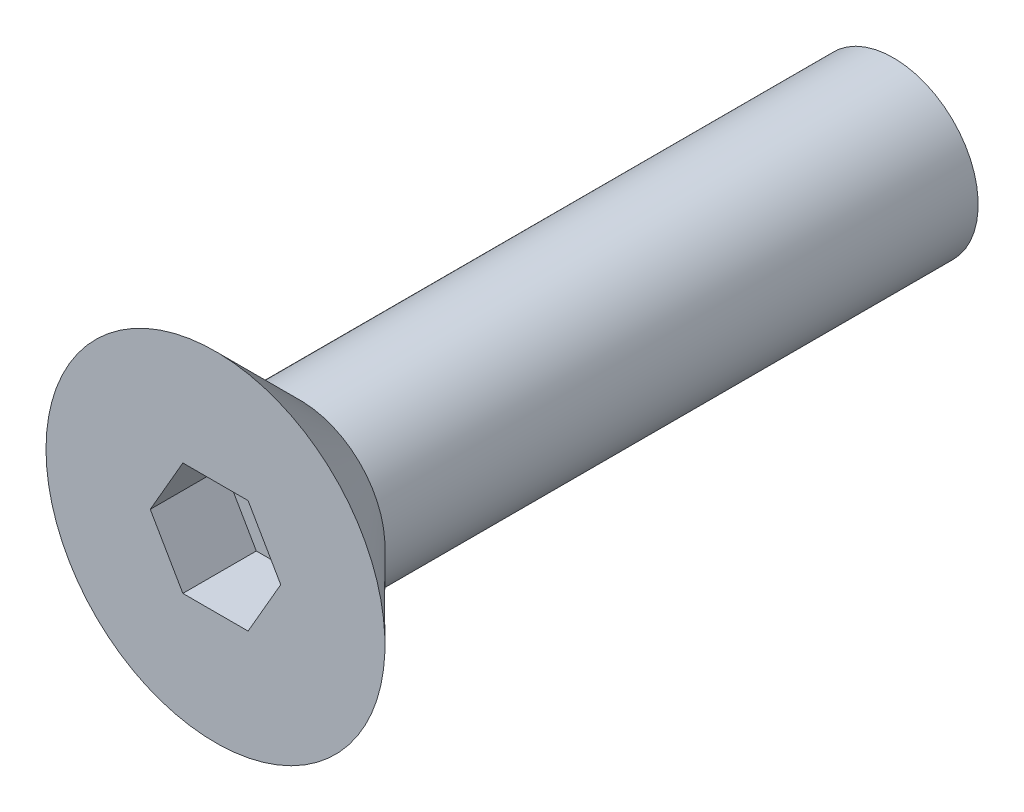
ISO-10303-21;
HEADER;
FILE_DESCRIPTION(('STEP AP214'),'2;1');
FILE_NAME('part.step','',(''),(''),'','','');
FILE_SCHEMA(('AUTOMOTIVE_DESIGN { 1 0 10303 214 1 1 1 1 }'));
ENDSEC;
DATA;
#1=APPLICATION_CONTEXT('core data for automotive mechanical design processes');
#2=APPLICATION_PROTOCOL_DEFINITION('international standard','automotive_design',2000,#1);
#3=PRODUCT_CONTEXT('',#1,'mechanical');
#4=PRODUCT('Part','Part','',(#3));
#5=PRODUCT_RELATED_PRODUCT_CATEGORY('part','',(#4));
#6=PRODUCT_DEFINITION_FORMATION('','',#4);
#7=PRODUCT_DEFINITION_CONTEXT('part definition',#1,'design');
#8=PRODUCT_DEFINITION('design','',#6,#7);
#9=PRODUCT_DEFINITION_SHAPE('','',#8);
#10=(LENGTH_UNIT() NAMED_UNIT(*) SI_UNIT(.MILLI.,.METRE.));
#11=(NAMED_UNIT(*) PLANE_ANGLE_UNIT() SI_UNIT($,.RADIAN.));
#12=(NAMED_UNIT(*) SI_UNIT($,.STERADIAN.) SOLID_ANGLE_UNIT());
#13=UNCERTAINTY_MEASURE_WITH_UNIT(LENGTH_MEASURE(1.E-05),#10,'distance_accuracy_value','');
#14=(GEOMETRIC_REPRESENTATION_CONTEXT(3) GLOBAL_UNCERTAINTY_ASSIGNED_CONTEXT((#13)) GLOBAL_UNIT_ASSIGNED_CONTEXT((#10,
#11,#12)) REPRESENTATION_CONTEXT('',''));
#15=CARTESIAN_POINT('',(0.,0.,0.));
#16=DIRECTION('',(0.,0.,1.));
#17=DIRECTION('',(1.,0.,0.));
#18=AXIS2_PLACEMENT_3D('',#15,#16,#17);
#19=CARTESIAN_POINT('',(0.,0.,-1.3));
#20=DIRECTION('',(0.,0.,1.));
#21=DIRECTION('',(1.,0.,0.));
#22=AXIS2_PLACEMENT_3D('',#19,#20,#21);
#23=PLANE('',#22);
#24=DIRECTION('',(-0.50000000000019,0.866025403784329,0.));
#25=VECTOR('',#24,1.);
#26=CARTESIAN_POINT('',(1.154700538379,0.,-1.3));
#27=LINE('',#26,#25);
#28=CARTESIAN_POINT('',(1.154700538379,0.,-1.3));
#29=VERTEX_POINT('',#28);
#30=CARTESIAN_POINT('',(0.57735026919,1.,-1.3));
#31=VERTEX_POINT('',#30);
#32=EDGE_CURVE('E10',#29,#31,#27,.T.);
#33=ORIENTED_EDGE('',*,*,#32,.T.);
#34=DIRECTION('',(-1.,0.,0.));
#35=VECTOR('',#34,1.);
#36=CARTESIAN_POINT('',(0.57735026919,1.,-1.3));
#37=LINE('',#36,#35);
#38=CARTESIAN_POINT('',(-0.57735026919,1.,-1.3));
#39=VERTEX_POINT('',#38);
#40=EDGE_CURVE('E124',#31,#39,#37,.T.);
#41=ORIENTED_EDGE('',*,*,#40,.T.);
#42=DIRECTION('',(-0.50000000000019,-0.866025403784329,0.));
#43=VECTOR('',#42,1.);
#44=CARTESIAN_POINT('',(-0.57735026919,1.,-1.3));
#45=LINE('',#44,#43);
#46=CARTESIAN_POINT('',(-1.154700538379,0.,-1.3));
#47=VERTEX_POINT('',#46);
#48=EDGE_CURVE('E136',#39,#47,#45,.T.);
#49=ORIENTED_EDGE('',*,*,#48,.T.);
#50=DIRECTION('',(0.50000000000019,-0.866025403784329,0.));
#51=VECTOR('',#50,1.);
#52=CARTESIAN_POINT('',(-1.154700538379,0.,-1.3));
#53=LINE('',#52,#51);
#54=CARTESIAN_POINT('',(-0.57735026919,-1.,-1.3));
#55=VERTEX_POINT('',#54);
#56=EDGE_CURVE('E144',#47,#55,#53,.T.);
#57=ORIENTED_EDGE('',*,*,#56,.T.);
#58=DIRECTION('',(1.,0.,0.));
#59=VECTOR('',#58,1.);
#60=CARTESIAN_POINT('',(-0.57735026919,-1.,-1.3));
#61=LINE('',#60,#59);
#62=CARTESIAN_POINT('',(0.57735026919,-1.,-1.3));
#63=VERTEX_POINT('',#62);
#64=EDGE_CURVE('E122',#55,#63,#61,.T.);
#65=ORIENTED_EDGE('',*,*,#64,.T.);
#66=DIRECTION('',(0.50000000000019,0.866025403784329,0.));
#67=VECTOR('',#66,1.);
#68=CARTESIAN_POINT('',(0.57735026919,-1.,-1.3));
#69=LINE('',#68,#67);
#70=EDGE_CURVE('E111',#63,#29,#69,.T.);
#71=ORIENTED_EDGE('',*,*,#70,.T.);
#72=EDGE_LOOP('',(#33,#41,#49,#57,#65,#71));
#73=FACE_BOUND('',#72,.T.);
#74=ADVANCED_FACE('F15',(#73),#23,.T.);
#75=CARTESIAN_POINT('',(1.154700538379,0.,-1.3));
#76=DIRECTION('',(-0.866025403784329,-0.50000000000019,0.));
#77=DIRECTION('',(-0.50000000000019,0.866025403784329,0.));
#78=AXIS2_PLACEMENT_3D('',#75,#76,#77);
#79=PLANE('',#78);
#80=ORIENTED_EDGE('',*,*,#32,.F.);
#81=DIRECTION('',(0.,0.,1.));
#82=VECTOR('',#81,1.);
#83=CARTESIAN_POINT('',(1.154700538379,0.,-1.3));
#84=LINE('',#83,#82);
#85=CARTESIAN_POINT('',(1.154700538379,0.,0.));
#86=VERTEX_POINT('',#85);
#87=EDGE_CURVE('E119',#29,#86,#84,.T.);
#88=ORIENTED_EDGE('',*,*,#87,.T.);
#89=DIRECTION('',(-0.50000000000019,0.866025403784329,0.));
#90=VECTOR('',#89,1.);
#91=CARTESIAN_POINT('',(1.010362971082,0.25,0.));
#92=LINE('',#91,#90);
#93=CARTESIAN_POINT('',(0.57735026919,1.,0.));
#94=VERTEX_POINT('',#93);
#95=EDGE_CURVE('E148',#86,#94,#92,.T.);
#96=ORIENTED_EDGE('',*,*,#95,.T.);
#97=DIRECTION('',(0.,0.,1.));
#98=VECTOR('',#97,1.);
#99=CARTESIAN_POINT('',(0.57735026919,1.,-1.3));
#100=LINE('',#99,#98);
#101=EDGE_CURVE('E26',#31,#94,#100,.T.);
#102=ORIENTED_EDGE('',*,*,#101,.F.);
#103=EDGE_LOOP('',(#80,#88,#96,#102));
#104=FACE_BOUND('',#103,.T.);
#105=ADVANCED_FACE('F17',(#104),#79,.T.);
#106=CARTESIAN_POINT('',(0.57735026919,1.,-1.3));
#107=DIRECTION('',(0.,-1.,0.));
#108=DIRECTION('',(-1.,0.,0.));
#109=AXIS2_PLACEMENT_3D('',#106,#107,#108);
#110=PLANE('',#109);
#111=ORIENTED_EDGE('',*,*,#40,.F.);
#112=ORIENTED_EDGE('',*,*,#101,.T.);
#113=DIRECTION('',(-1.,0.,0.));
#114=VECTOR('',#113,1.);
#115=CARTESIAN_POINT('',(0.288675134595,1.,0.));
#116=LINE('',#115,#114);
#117=CARTESIAN_POINT('',(-0.57735026919,1.,0.));
#118=VERTEX_POINT('',#117);
#119=EDGE_CURVE('E19',#94,#118,#116,.T.);
#120=ORIENTED_EDGE('',*,*,#119,.T.);
#121=DIRECTION('',(0.,0.,1.));
#122=VECTOR('',#121,1.);
#123=CARTESIAN_POINT('',(-0.57735026919,1.,-1.3));
#124=LINE('',#123,#122);
#125=EDGE_CURVE('E127',#39,#118,#124,.T.);
#126=ORIENTED_EDGE('',*,*,#125,.F.);
#127=EDGE_LOOP('',(#111,#112,#120,#126));
#128=FACE_BOUND('',#127,.T.);
#129=ADVANCED_FACE('F160',(#128),#110,.T.);
#130=CARTESIAN_POINT('',(-0.57735026919,1.,-1.3));
#131=DIRECTION('',(0.866025403784329,-0.50000000000019,0.));
#132=DIRECTION('',(0.,0.,-1.));
#133=AXIS2_PLACEMENT_3D('',#130,#131,#132);
#134=PLANE('',#133);
#135=ORIENTED_EDGE('',*,*,#48,.F.);
#136=ORIENTED_EDGE('',*,*,#125,.T.);
#137=DIRECTION('',(-0.50000000000019,-0.866025403784329,0.));
#138=VECTOR('',#137,1.);
#139=CARTESIAN_POINT('',(-0.721687836487,0.75,0.));
#140=LINE('',#139,#138);
#141=CARTESIAN_POINT('',(-1.154700538379,0.,0.));
#142=VERTEX_POINT('',#141);
#143=EDGE_CURVE('E131',#118,#142,#140,.T.);
#144=ORIENTED_EDGE('',*,*,#143,.T.);
#145=DIRECTION('',(0.,0.,1.));
#146=VECTOR('',#145,1.);
#147=CARTESIAN_POINT('',(-1.154700538379,0.,-1.3));
#148=LINE('',#147,#146);
#149=EDGE_CURVE('E141',#47,#142,#148,.T.);
#150=ORIENTED_EDGE('',*,*,#149,.F.);
#151=EDGE_LOOP('',(#135,#136,#144,#150));
#152=FACE_BOUND('',#151,.T.);
#153=ADVANCED_FACE('F209',(#152),#134,.T.);
#154=CARTESIAN_POINT('',(-1.154700538379,0.,-1.3));
#155=DIRECTION('',(0.866025403784329,0.50000000000019,0.));
#156=DIRECTION('',(0.,0.,-1.));
#157=AXIS2_PLACEMENT_3D('',#154,#155,#156);
#158=PLANE('',#157);
#159=ORIENTED_EDGE('',*,*,#56,.F.);
#160=ORIENTED_EDGE('',*,*,#149,.T.);
#161=DIRECTION('',(0.50000000000019,-0.866025403784329,0.));
#162=VECTOR('',#161,1.);
#163=CARTESIAN_POINT('',(-1.010362971082,-0.25,0.));
#164=LINE('',#163,#162);
#165=CARTESIAN_POINT('',(-0.57735026919,-1.,0.));
#166=VERTEX_POINT('',#165);
#167=EDGE_CURVE('E104',#142,#166,#164,.T.);
#168=ORIENTED_EDGE('',*,*,#167,.T.);
#169=DIRECTION('',(0.,0.,1.));
#170=VECTOR('',#169,1.);
#171=CARTESIAN_POINT('',(-0.57735026919,-1.,-1.3));
#172=LINE('',#171,#170);
#173=EDGE_CURVE('E130',#55,#166,#172,.T.);
#174=ORIENTED_EDGE('',*,*,#173,.F.);
#175=EDGE_LOOP('',(#159,#160,#168,#174));
#176=FACE_BOUND('',#175,.T.);
#177=ADVANCED_FACE('F225',(#176),#158,.T.);
#178=CARTESIAN_POINT('',(-0.57735026919,-1.,-1.3));
#179=DIRECTION('',(0.,1.,0.));
#180=DIRECTION('',(1.,0.,0.));
#181=AXIS2_PLACEMENT_3D('',#178,#179,#180);
#182=PLANE('',#181);
#183=ORIENTED_EDGE('',*,*,#64,.F.);
#184=ORIENTED_EDGE('',*,*,#173,.T.);
#185=DIRECTION('',(1.,0.,0.));
#186=VECTOR('',#185,1.);
#187=CARTESIAN_POINT('',(-0.288675134595,-1.,0.));
#188=LINE('',#187,#186);
#189=CARTESIAN_POINT('',(0.57735026919,-1.,0.));
#190=VERTEX_POINT('',#189);
#191=EDGE_CURVE('E96',#166,#190,#188,.T.);
#192=ORIENTED_EDGE('',*,*,#191,.T.);
#193=DIRECTION('',(0.,0.,1.));
#194=VECTOR('',#193,1.);
#195=CARTESIAN_POINT('',(0.57735026919,-1.,-1.3));
#196=LINE('',#195,#194);
#197=EDGE_CURVE('E123',#63,#190,#196,.T.);
#198=ORIENTED_EDGE('',*,*,#197,.F.);
#199=EDGE_LOOP('',(#183,#184,#192,#198));
#200=FACE_BOUND('',#199,.T.);
#201=ADVANCED_FACE('F196',(#200),#182,.T.);
#202=CARTESIAN_POINT('',(0.57735026919,-1.,-1.3));
#203=DIRECTION('',(-0.866025403784329,0.50000000000019,0.));
#204=DIRECTION('',(0.,0.,1.));
#205=AXIS2_PLACEMENT_3D('',#202,#203,#204);
#206=PLANE('',#205);
#207=ORIENTED_EDGE('',*,*,#70,.F.);
#208=ORIENTED_EDGE('',*,*,#197,.T.);
#209=DIRECTION('',(0.50000000000019,0.866025403784329,0.));
#210=VECTOR('',#209,1.);
#211=CARTESIAN_POINT('',(0.721687836487,-0.75,0.));
#212=LINE('',#211,#210);
#213=EDGE_CURVE('E152',#190,#86,#212,.T.);
#214=ORIENTED_EDGE('',*,*,#213,.T.);
#215=ORIENTED_EDGE('',*,*,#87,.F.);
#216=EDGE_LOOP('',(#207,#208,#214,#215));
#217=FACE_BOUND('',#216,.T.);
#218=ADVANCED_FACE('F191',(#217),#206,.T.);
#219=CARTESIAN_POINT('',(0.,0.,-12.));
#220=DIRECTION('',(0.,0.,-1.));
#221=DIRECTION('',(0.,-1.,0.));
#222=AXIS2_PLACEMENT_3D('',#219,#220,#221);
#223=PLANE('',#222);
#224=CARTESIAN_POINT('',(0.,0.,-12.));
#225=DIRECTION('',(0.,0.,-1.));
#226=DIRECTION('',(-1.,0.,0.));
#227=AXIS2_PLACEMENT_3D('',#224,#225,#226);
#228=CIRCLE('',#227,1.5);
#229=CARTESIAN_POINT('',(-1.5,0.,-12.));
#230=VERTEX_POINT('',#229);
#231=EDGE_CURVE('E91',#230,#230,#228,.T.);
#232=ORIENTED_EDGE('',*,*,#231,.T.);
#233=EDGE_LOOP('',(#232));
#234=FACE_BOUND('',#233,.T.);
#235=ADVANCED_FACE('F92',(#234),#223,.T.);
#236=CARTESIAN_POINT('',(0.,0.,0.));
#237=DIRECTION('',(0.,0.,-1.));
#238=DIRECTION('',(0.,-1.,0.));
#239=AXIS2_PLACEMENT_3D('',#236,#237,#238);
#240=PLANE('',#239);
#241=ORIENTED_EDGE('',*,*,#191,.F.);
#242=ORIENTED_EDGE('',*,*,#167,.F.);
#243=ORIENTED_EDGE('',*,*,#143,.F.);
#244=ORIENTED_EDGE('',*,*,#119,.F.);
#245=ORIENTED_EDGE('',*,*,#95,.F.);
#246=ORIENTED_EDGE('',*,*,#213,.F.);
#247=EDGE_LOOP('',(#241,#242,#243,#244,#245,#246));
#248=FACE_BOUND('',#247,.T.);
#249=CARTESIAN_POINT('',(0.,0.,0.));
#250=DIRECTION('',(0.,0.,-1.));
#251=DIRECTION('',(-1.,0.,0.));
#252=AXIS2_PLACEMENT_3D('',#249,#250,#251);
#253=CIRCLE('',#252,3.);
#254=CARTESIAN_POINT('',(-3.,0.,0.));
#255=VERTEX_POINT('',#254);
#256=EDGE_CURVE('E107',#255,#255,#253,.T.);
#257=ORIENTED_EDGE('',*,*,#256,.F.);
#258=EDGE_LOOP('',(#257));
#259=FACE_BOUND('',#258,.T.);
#260=ADVANCED_FACE('F171',(#248,#259),#240,.F.);
#261=CARTESIAN_POINT('',(0.,0.,0.));
#262=DIRECTION('',(0.,0.,-1.));
#263=DIRECTION('',(-1.,0.,0.));
#264=AXIS2_PLACEMENT_3D('',#261,#262,#263);
#265=CYLINDRICAL_SURFACE('',#264,1.5);
#266=DIRECTION('',(0.,0.,-1.));
#267=VECTOR('',#266,1.);
#268=CARTESIAN_POINT('',(-1.5,0.,0.));
#269=LINE('',#268,#267);
#270=CARTESIAN_POINT('',(-1.5,0.,-1.5));
#271=VERTEX_POINT('',#270);
#272=EDGE_CURVE('E97',#271,#230,#269,.T.);
#273=ORIENTED_EDGE('',*,*,#272,.T.);
#274=ORIENTED_EDGE('',*,*,#231,.F.);
#275=ORIENTED_EDGE('',*,*,#272,.F.);
#276=CARTESIAN_POINT('',(0.,0.,-1.5));
#277=DIRECTION('',(0.,0.,-1.));
#278=DIRECTION('',(-1.,0.,0.));
#279=AXIS2_PLACEMENT_3D('',#276,#277,#278);
#280=CIRCLE('',#279,1.5);
#281=EDGE_CURVE('E115',#271,#271,#280,.T.);
#282=ORIENTED_EDGE('',*,*,#281,.T.);
#283=EDGE_LOOP('',(#273,#274,#275,#282));
#284=FACE_BOUND('',#283,.T.);
#285=ADVANCED_FACE('F239',(#284),#265,.T.);
#286=CARTESIAN_POINT('',(0.,0.,0.));
#287=DIRECTION('',(0.,0.,1.));
#288=DIRECTION('',(-1.,0.,0.));
#289=AXIS2_PLACEMENT_3D('',#286,#287,#288);
#290=CONICAL_SURFACE('',#289,3.,0.785398163397);
#291=ORIENTED_EDGE('',*,*,#281,.F.);
#292=DIRECTION('',(0.707106781186548,0.,-0.707106781186548));
#293=VECTOR('',#292,1.);
#294=CARTESIAN_POINT('',(-3.,0.,0.));
#295=LINE('',#294,#293);
#296=EDGE_CURVE('E113',#255,#271,#295,.T.);
#297=ORIENTED_EDGE('',*,*,#296,.F.);
#298=ORIENTED_EDGE('',*,*,#256,.T.);
#299=ORIENTED_EDGE('',*,*,#296,.T.);
#300=EDGE_LOOP('',(#291,#297,#298,#299));
#301=FACE_BOUND('',#300,.T.);
#302=ADVANCED_FACE('F246',(#301),#290,.T.);
#303=CLOSED_SHELL('',(#74,#105,#129,#153,#177,#201,#218,#235,#260,#285,#302));
#304=MANIFOLD_SOLID_BREP('B1',#303);
#305=ADVANCED_BREP_SHAPE_REPRESENTATION('',(#18,#304),#14);
#306=SHAPE_DEFINITION_REPRESENTATION(#9,#305);
ENDSEC;
END-ISO-10303-21;
